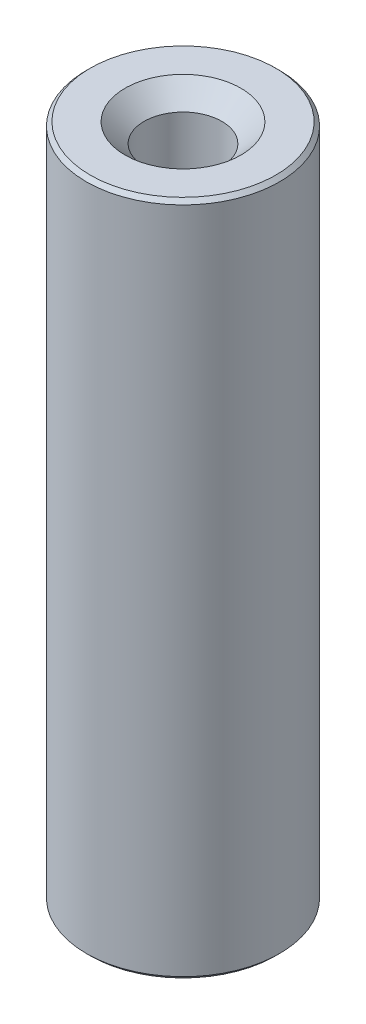
ISO-10303-21;
HEADER;
FILE_DESCRIPTION(('STEP AP214'),'2;1');
FILE_NAME('part.step','',(''),(''),'','','');
FILE_SCHEMA(('AUTOMOTIVE_DESIGN { 1 0 10303 214 1 1 1 1 }'));
ENDSEC;
DATA;
#1=APPLICATION_CONTEXT('core data for automotive mechanical design processes');
#2=APPLICATION_PROTOCOL_DEFINITION('international standard','automotive_design',2000,#1);
#3=PRODUCT_CONTEXT('',#1,'mechanical');
#4=PRODUCT('Part','Part','',(#3));
#5=PRODUCT_RELATED_PRODUCT_CATEGORY('part','',(#4));
#6=PRODUCT_DEFINITION_FORMATION('','',#4);
#7=PRODUCT_DEFINITION_CONTEXT('part definition',#1,'design');
#8=PRODUCT_DEFINITION('design','',#6,#7);
#9=PRODUCT_DEFINITION_SHAPE('','',#8);
#10=(LENGTH_UNIT() NAMED_UNIT(*) SI_UNIT(.MILLI.,.METRE.));
#11=(NAMED_UNIT(*) PLANE_ANGLE_UNIT() SI_UNIT($,.RADIAN.));
#12=(NAMED_UNIT(*) SI_UNIT($,.STERADIAN.) SOLID_ANGLE_UNIT());
#13=UNCERTAINTY_MEASURE_WITH_UNIT(LENGTH_MEASURE(1.E-05),#10,'distance_accuracy_value','');
#14=(GEOMETRIC_REPRESENTATION_CONTEXT(3) GLOBAL_UNCERTAINTY_ASSIGNED_CONTEXT((#13)) GLOBAL_UNIT_ASSIGNED_CONTEXT((#10,
#11,#12)) REPRESENTATION_CONTEXT('',''));
#15=CARTESIAN_POINT('',(0.,0.,0.));
#16=DIRECTION('',(0.,0.,1.));
#17=DIRECTION('',(1.,0.,0.));
#18=AXIS2_PLACEMENT_3D('',#15,#16,#17);
#19=CARTESIAN_POINT('',(0.,44.45,0.));
#20=DIRECTION('',(0.,-1.,0.));
#21=DIRECTION('',(0.,0.,-1.));
#22=AXIS2_PLACEMENT_3D('',#19,#20,#21);
#23=CYLINDRICAL_SURFACE('',#22,6.35);
#24=CARTESIAN_POINT('',(0.,0.25399999999999,0.));
#25=DIRECTION('',(0.,1.,0.));
#26=DIRECTION('',(0.,0.,1.));
#27=AXIS2_PLACEMENT_3D('',#24,#25,#26);
#28=CIRCLE('',#27,6.35);
#29=CARTESIAN_POINT('',(0.,0.25399999999999,6.35));
#30=VERTEX_POINT('',#29);
#31=EDGE_CURVE('E46',#30,#30,#28,.T.);
#32=ORIENTED_EDGE('',*,*,#31,.T.);
#33=EDGE_LOOP('',(#32));
#34=FACE_BOUND('',#33,.T.);
#35=CARTESIAN_POINT('',(0.,44.196,0.));
#36=DIRECTION('',(0.,1.,0.));
#37=DIRECTION('',(0.,0.,1.));
#38=AXIS2_PLACEMENT_3D('',#35,#36,#37);
#39=CIRCLE('',#38,6.35);
#40=CARTESIAN_POINT('',(0.,44.196,6.35));
#41=VERTEX_POINT('',#40);
#42=EDGE_CURVE('E50',#41,#41,#39,.F.);
#43=ORIENTED_EDGE('',*,*,#42,.T.);
#44=EDGE_LOOP('',(#43));
#45=FACE_BOUND('',#44,.T.);
#46=ADVANCED_FACE('F35',(#34,#45),#23,.T.);
#47=CARTESIAN_POINT('',(0.,44.45,0.));
#48=DIRECTION('',(0.,1.,0.));
#49=DIRECTION('',(0.,0.,1.));
#50=AXIS2_PLACEMENT_3D('',#47,#48,#49);
#51=PLANE('',#50);
#52=CARTESIAN_POINT('',(0.,44.45,0.));
#53=DIRECTION('',(0.,1.,0.));
#54=DIRECTION('',(0.,0.,1.));
#55=AXIS2_PLACEMENT_3D('',#52,#53,#54);
#56=CIRCLE('',#55,6.096);
#57=CARTESIAN_POINT('',(0.,44.45,6.096));
#58=VERTEX_POINT('',#57);
#59=EDGE_CURVE('E10',#58,#58,#56,.T.);
#60=ORIENTED_EDGE('',*,*,#59,.T.);
#61=EDGE_LOOP('',(#60));
#62=FACE_BOUND('',#61,.T.);
#63=CARTESIAN_POINT('',(0.,44.45,0.));
#64=DIRECTION('',(0.,1.,0.));
#65=DIRECTION('',(0.,0.,1.));
#66=AXIS2_PLACEMENT_3D('',#63,#64,#65);
#67=CIRCLE('',#66,3.81);
#68=CARTESIAN_POINT('',(0.,44.45,3.81));
#69=VERTEX_POINT('',#68);
#70=EDGE_CURVE('E61',#69,#69,#67,.T.);
#71=ORIENTED_EDGE('',*,*,#70,.F.);
#72=EDGE_LOOP('',(#71));
#73=FACE_BOUND('',#72,.T.);
#74=ADVANCED_FACE('F89',(#62,#73),#51,.T.);
#75=CARTESIAN_POINT('',(0.,0.,0.));
#76=DIRECTION('',(0.,1.,0.));
#77=DIRECTION('',(0.,0.,1.));
#78=AXIS2_PLACEMENT_3D('',#75,#76,#77);
#79=PLANE('',#78);
#80=CARTESIAN_POINT('',(0.,0.,0.));
#81=DIRECTION('',(0.,1.,0.));
#82=DIRECTION('',(0.,0.,1.));
#83=AXIS2_PLACEMENT_3D('',#80,#81,#82);
#84=CIRCLE('',#83,6.09600000000001);
#85=CARTESIAN_POINT('',(0.,0.,6.09600000000001));
#86=VERTEX_POINT('',#85);
#87=EDGE_CURVE('E42',#86,#86,#84,.F.);
#88=ORIENTED_EDGE('',*,*,#87,.T.);
#89=EDGE_LOOP('',(#88));
#90=FACE_BOUND('',#89,.T.);
#91=CARTESIAN_POINT('',(0.,0.,0.));
#92=DIRECTION('',(0.,1.,0.));
#93=DIRECTION('',(0.,0.,1.));
#94=AXIS2_PLACEMENT_3D('',#91,#92,#93);
#95=CIRCLE('',#94,3.80999999999999);
#96=CARTESIAN_POINT('',(0.,0.,3.80999999999999));
#97=VERTEX_POINT('',#96);
#98=EDGE_CURVE('E64',#97,#97,#95,.T.);
#99=ORIENTED_EDGE('',*,*,#98,.T.);
#100=EDGE_LOOP('',(#99));
#101=FACE_BOUND('',#100,.T.);
#102=ADVANCED_FACE('F68',(#90,#101),#79,.F.);
#103=CARTESIAN_POINT('',(0.,1.2573,0.));
#104=DIRECTION('',(0.,-1.,0.));
#105=DIRECTION('',(0.,0.,-1.));
#106=AXIS2_PLACEMENT_3D('',#103,#104,#105);
#107=CONICAL_SURFACE('',#106,2.55269999999999,0.785398163397446);
#108=ORIENTED_EDGE('',*,*,#98,.F.);
#109=EDGE_LOOP('',(#108));
#110=FACE_BOUND('',#109,.T.);
#111=CARTESIAN_POINT('',(0.,1.2573,0.));
#112=DIRECTION('',(0.,1.,0.));
#113=DIRECTION('',(0.,0.,1.));
#114=AXIS2_PLACEMENT_3D('',#111,#112,#113);
#115=CIRCLE('',#114,2.55269999999999);
#116=CARTESIAN_POINT('',(0.,1.2573,2.55269999999999));
#117=VERTEX_POINT('',#116);
#118=EDGE_CURVE('E55',#117,#117,#115,.T.);
#119=ORIENTED_EDGE('',*,*,#118,.T.);
#120=EDGE_LOOP('',(#119));
#121=FACE_BOUND('',#120,.T.);
#122=ADVANCED_FACE('F70',(#110,#121),#107,.F.);
#123=CARTESIAN_POINT('',(0.,44.45,0.));
#124=DIRECTION('',(0.,1.,0.));
#125=DIRECTION('',(0.,0.,1.));
#126=AXIS2_PLACEMENT_3D('',#123,#124,#125);
#127=CYLINDRICAL_SURFACE('',#126,2.55269999999999);
#128=ORIENTED_EDGE('',*,*,#118,.F.);
#129=EDGE_LOOP('',(#128));
#130=FACE_BOUND('',#129,.T.);
#131=CARTESIAN_POINT('',(0.,43.1927,0.));
#132=DIRECTION('',(0.,1.,0.));
#133=DIRECTION('',(0.,0.,1.));
#134=AXIS2_PLACEMENT_3D('',#131,#132,#133);
#135=CIRCLE('',#134,2.5527);
#136=CARTESIAN_POINT('',(0.,43.1927,2.5527));
#137=VERTEX_POINT('',#136);
#138=EDGE_CURVE('E58',#137,#137,#135,.T.);
#139=ORIENTED_EDGE('',*,*,#138,.T.);
#140=EDGE_LOOP('',(#139));
#141=FACE_BOUND('',#140,.T.);
#142=ADVANCED_FACE('F73',(#130,#141),#127,.F.);
#143=CARTESIAN_POINT('',(0.,44.45,0.));
#144=DIRECTION('',(0.,1.,0.));
#145=DIRECTION('',(0.,0.,1.));
#146=AXIS2_PLACEMENT_3D('',#143,#144,#145);
#147=CONICAL_SURFACE('',#146,3.81,0.785398163397449);
#148=ORIENTED_EDGE('',*,*,#138,.F.);
#149=EDGE_LOOP('',(#148));
#150=FACE_BOUND('',#149,.T.);
#151=ORIENTED_EDGE('',*,*,#70,.T.);
#152=EDGE_LOOP('',(#151));
#153=FACE_BOUND('',#152,.T.);
#154=ADVANCED_FACE('F79',(#150,#153),#147,.F.);
#155=CARTESIAN_POINT('',(0.,0.25399999999999,0.));
#156=DIRECTION('',(0.,1.,0.));
#157=DIRECTION('',(0.,0.,1.));
#158=AXIS2_PLACEMENT_3D('',#155,#156,#157);
#159=CONICAL_SURFACE('',#158,6.35,0.785398163397447);
#160=ORIENTED_EDGE('',*,*,#87,.F.);
#161=EDGE_LOOP('',(#160));
#162=FACE_BOUND('',#161,.T.);
#163=ORIENTED_EDGE('',*,*,#31,.F.);
#164=EDGE_LOOP('',(#163));
#165=FACE_BOUND('',#164,.T.);
#166=ADVANCED_FACE('F85',(#162,#165),#159,.T.);
#167=CARTESIAN_POINT('',(0.,44.45,0.));
#168=DIRECTION('',(0.,-1.,0.));
#169=DIRECTION('',(0.,0.,-1.));
#170=AXIS2_PLACEMENT_3D('',#167,#168,#169);
#171=CONICAL_SURFACE('',#170,6.096,0.785398163397447);
#172=ORIENTED_EDGE('',*,*,#42,.F.);
#173=EDGE_LOOP('',(#172));
#174=FACE_BOUND('',#173,.T.);
#175=ORIENTED_EDGE('',*,*,#59,.F.);
#176=EDGE_LOOP('',(#175));
#177=FACE_BOUND('',#176,.T.);
#178=ADVANCED_FACE('F37',(#174,#177),#171,.T.);
#179=CLOSED_SHELL('',(#46,#74,#102,#122,#142,#154,#166,#178));
#180=MANIFOLD_SOLID_BREP('B2',#179);
#181=ADVANCED_BREP_SHAPE_REPRESENTATION('',(#18,#180),#14);
#182=SHAPE_DEFINITION_REPRESENTATION(#9,#181);
ENDSEC;
END-ISO-10303-21;
